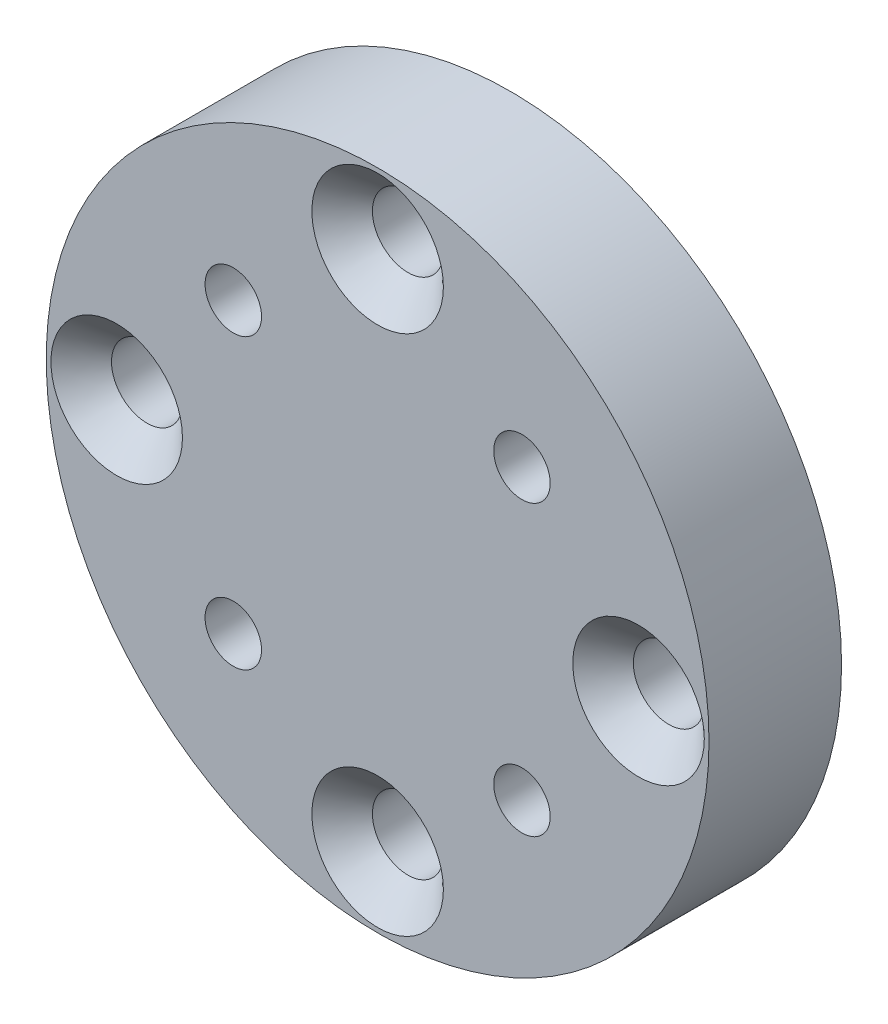
ISO-10303-21;
HEADER;
FILE_DESCRIPTION(('STEP AP214'),'2;1');
FILE_NAME('part.step','',(''),(''),'','','');
FILE_SCHEMA(('AUTOMOTIVE_DESIGN { 1 0 10303 214 1 1 1 1 }'));
ENDSEC;
DATA;
#1=APPLICATION_CONTEXT('core data for automotive mechanical design processes');
#2=APPLICATION_PROTOCOL_DEFINITION('international standard','automotive_design',2000,#1);
#3=PRODUCT_CONTEXT('',#1,'mechanical');
#4=PRODUCT('Part','Part','',(#3));
#5=PRODUCT_RELATED_PRODUCT_CATEGORY('part','',(#4));
#6=PRODUCT_DEFINITION_FORMATION('','',#4);
#7=PRODUCT_DEFINITION_CONTEXT('part definition',#1,'design');
#8=PRODUCT_DEFINITION('design','',#6,#7);
#9=PRODUCT_DEFINITION_SHAPE('','',#8);
#10=(LENGTH_UNIT() NAMED_UNIT(*) SI_UNIT(.MILLI.,.METRE.));
#11=(NAMED_UNIT(*) PLANE_ANGLE_UNIT() SI_UNIT($,.RADIAN.));
#12=(NAMED_UNIT(*) SI_UNIT($,.STERADIAN.) SOLID_ANGLE_UNIT());
#13=UNCERTAINTY_MEASURE_WITH_UNIT(LENGTH_MEASURE(1.E-05),#10,'distance_accuracy_value','');
#14=(GEOMETRIC_REPRESENTATION_CONTEXT(3) GLOBAL_UNCERTAINTY_ASSIGNED_CONTEXT((#13)) GLOBAL_UNIT_ASSIGNED_CONTEXT((#10,
#11,#12)) REPRESENTATION_CONTEXT('',''));
#15=CARTESIAN_POINT('',(0.,0.,0.));
#16=DIRECTION('',(0.,0.,1.));
#17=DIRECTION('',(1.,0.,0.));
#18=AXIS2_PLACEMENT_3D('',#15,#16,#17);
#19=CARTESIAN_POINT('',(0.,0.,6.35));
#20=DIRECTION('',(0.,0.,-1.));
#21=DIRECTION('',(-1.,0.,0.));
#22=AXIS2_PLACEMENT_3D('',#19,#20,#21);
#23=CYLINDRICAL_SURFACE('',#22,15.875);
#24=CARTESIAN_POINT('',(0.,0.,6.35));
#25=DIRECTION('',(0.,0.,1.));
#26=DIRECTION('',(1.,0.,0.));
#27=AXIS2_PLACEMENT_3D('',#24,#25,#26);
#28=CIRCLE('',#27,15.875);
#29=CARTESIAN_POINT('',(15.875,0.,6.35));
#30=VERTEX_POINT('',#29);
#31=EDGE_CURVE('E10',#30,#30,#28,.T.);
#32=ORIENTED_EDGE('',*,*,#31,.F.);
#33=EDGE_LOOP('',(#32));
#34=FACE_BOUND('',#33,.T.);
#35=CARTESIAN_POINT('',(0.,0.,0.));
#36=DIRECTION('',(0.,0.,1.));
#37=DIRECTION('',(1.,0.,0.));
#38=AXIS2_PLACEMENT_3D('',#35,#36,#37);
#39=CIRCLE('',#38,15.875);
#40=CARTESIAN_POINT('',(15.875,0.,0.));
#41=VERTEX_POINT('',#40);
#42=EDGE_CURVE('E35',#41,#41,#39,.T.);
#43=ORIENTED_EDGE('',*,*,#42,.T.);
#44=EDGE_LOOP('',(#43));
#45=FACE_BOUND('',#44,.T.);
#46=ADVANCED_FACE('F32',(#34,#45),#23,.T.);
#47=CARTESIAN_POINT('',(0.,0.,6.35));
#48=DIRECTION('',(0.,0.,1.));
#49=DIRECTION('',(1.,0.,0.));
#50=AXIS2_PLACEMENT_3D('',#47,#48,#49);
#51=PLANE('',#50);
#52=CARTESIAN_POINT('',(6.91479721322325,6.91479721322325,6.35));
#53=DIRECTION('',(0.,0.,1.));
#54=DIRECTION('',(1.,0.,0.));
#55=AXIS2_PLACEMENT_3D('',#52,#53,#54);
#56=CIRCLE('',#55,1.35254999999999);
#57=CARTESIAN_POINT('',(8.26734721322324,6.91479721322325,6.35));
#58=VERTEX_POINT('',#57);
#59=EDGE_CURVE('E100',#58,#58,#56,.T.);
#60=ORIENTED_EDGE('',*,*,#59,.F.);
#61=EDGE_LOOP('',(#60));
#62=FACE_BOUND('',#61,.T.);
#63=CARTESIAN_POINT('',(6.91479721322324,-6.91479721322324,6.35));
#64=DIRECTION('',(0.,0.,1.));
#65=DIRECTION('',(1.,0.,0.));
#66=AXIS2_PLACEMENT_3D('',#63,#64,#65);
#67=CIRCLE('',#66,1.35254999999999);
#68=CARTESIAN_POINT('',(8.26734721322323,-6.91479721322324,6.35));
#69=VERTEX_POINT('',#68);
#70=EDGE_CURVE('E94',#69,#69,#67,.T.);
#71=ORIENTED_EDGE('',*,*,#70,.F.);
#72=EDGE_LOOP('',(#71));
#73=FACE_BOUND('',#72,.T.);
#74=CARTESIAN_POINT('',(-6.91479721322325,-6.91479721322325,6.35));
#75=DIRECTION('',(0.,0.,1.));
#76=DIRECTION('',(1.,0.,0.));
#77=AXIS2_PLACEMENT_3D('',#74,#75,#76);
#78=CIRCLE('',#77,1.35254999999999);
#79=CARTESIAN_POINT('',(-5.56224721322326,-6.91479721322325,6.35));
#80=VERTEX_POINT('',#79);
#81=EDGE_CURVE('E88',#80,#80,#78,.T.);
#82=ORIENTED_EDGE('',*,*,#81,.F.);
#83=EDGE_LOOP('',(#82));
#84=FACE_BOUND('',#83,.T.);
#85=CARTESIAN_POINT('',(-6.91479721322325,6.91479721322325,6.35));
#86=DIRECTION('',(0.,0.,1.));
#87=DIRECTION('',(1.,0.,0.));
#88=AXIS2_PLACEMENT_3D('',#85,#86,#87);
#89=CIRCLE('',#88,1.35254999999999);
#90=CARTESIAN_POINT('',(-5.56224721322326,6.91479721322325,6.35));
#91=VERTEX_POINT('',#90);
#92=EDGE_CURVE('E82',#91,#91,#89,.T.);
#93=ORIENTED_EDGE('',*,*,#92,.F.);
#94=EDGE_LOOP('',(#93));
#95=FACE_BOUND('',#94,.T.);
#96=CARTESIAN_POINT('',(0.,12.5,6.35));
#97=DIRECTION('',(0.,0.,1.));
#98=DIRECTION('',(1.,0.,0.));
#99=AXIS2_PLACEMENT_3D('',#96,#97,#98);
#100=CIRCLE('',#99,3.15);
#101=CARTESIAN_POINT('',(3.15,12.5,6.35));
#102=VERTEX_POINT('',#101);
#103=EDGE_CURVE('E76',#102,#102,#100,.T.);
#104=ORIENTED_EDGE('',*,*,#103,.F.);
#105=EDGE_LOOP('',(#104));
#106=FACE_BOUND('',#105,.T.);
#107=CARTESIAN_POINT('',(0.,-12.5,6.35));
#108=DIRECTION('',(0.,0.,1.));
#109=DIRECTION('',(1.,0.,0.));
#110=AXIS2_PLACEMENT_3D('',#107,#108,#109);
#111=CIRCLE('',#110,3.15);
#112=CARTESIAN_POINT('',(3.15,-12.5,6.35));
#113=VERTEX_POINT('',#112);
#114=EDGE_CURVE('E67',#113,#113,#111,.T.);
#115=ORIENTED_EDGE('',*,*,#114,.F.);
#116=EDGE_LOOP('',(#115));
#117=FACE_BOUND('',#116,.T.);
#118=CARTESIAN_POINT('',(12.5,0.,6.35));
#119=DIRECTION('',(0.,0.,1.));
#120=DIRECTION('',(1.,0.,0.));
#121=AXIS2_PLACEMENT_3D('',#118,#119,#120);
#122=CIRCLE('',#121,3.15);
#123=CARTESIAN_POINT('',(15.65,0.,6.35));
#124=VERTEX_POINT('',#123);
#125=EDGE_CURVE('E58',#124,#124,#122,.T.);
#126=ORIENTED_EDGE('',*,*,#125,.F.);
#127=EDGE_LOOP('',(#126));
#128=FACE_BOUND('',#127,.T.);
#129=CARTESIAN_POINT('',(-12.5,0.,6.35));
#130=DIRECTION('',(0.,0.,1.));
#131=DIRECTION('',(1.,0.,0.));
#132=AXIS2_PLACEMENT_3D('',#129,#130,#131);
#133=CIRCLE('',#132,3.15);
#134=CARTESIAN_POINT('',(-9.35,0.,6.35));
#135=VERTEX_POINT('',#134);
#136=EDGE_CURVE('E49',#135,#135,#133,.T.);
#137=ORIENTED_EDGE('',*,*,#136,.F.);
#138=EDGE_LOOP('',(#137));
#139=FACE_BOUND('',#138,.T.);
#140=ORIENTED_EDGE('',*,*,#31,.T.);
#141=EDGE_LOOP('',(#140));
#142=FACE_BOUND('',#141,.T.);
#143=ADVANCED_FACE('F106',(#62,#73,#84,#95,#106,#117,#128,#139,#142),#51,.T.);
#144=CARTESIAN_POINT('',(0.,0.,0.));
#145=DIRECTION('',(0.,0.,1.));
#146=DIRECTION('',(1.,0.,0.));
#147=AXIS2_PLACEMENT_3D('',#144,#145,#146);
#148=PLANE('',#147);
#149=CARTESIAN_POINT('',(6.91479721322325,6.91479721322325,0.));
#150=DIRECTION('',(0.,0.,1.));
#151=DIRECTION('',(1.,0.,0.));
#152=AXIS2_PLACEMENT_3D('',#149,#150,#151);
#153=CIRCLE('',#152,1.35255);
#154=CARTESIAN_POINT('',(8.26734721322325,6.91479721322325,0.));
#155=VERTEX_POINT('',#154);
#156=EDGE_CURVE('E97',#155,#155,#153,.T.);
#157=ORIENTED_EDGE('',*,*,#156,.T.);
#158=EDGE_LOOP('',(#157));
#159=FACE_BOUND('',#158,.T.);
#160=CARTESIAN_POINT('',(6.91479721322324,-6.91479721322324,0.));
#161=DIRECTION('',(0.,0.,1.));
#162=DIRECTION('',(1.,0.,0.));
#163=AXIS2_PLACEMENT_3D('',#160,#161,#162);
#164=CIRCLE('',#163,1.35255);
#165=CARTESIAN_POINT('',(8.26734721322324,-6.91479721322324,0.));
#166=VERTEX_POINT('',#165);
#167=EDGE_CURVE('E91',#166,#166,#164,.T.);
#168=ORIENTED_EDGE('',*,*,#167,.T.);
#169=EDGE_LOOP('',(#168));
#170=FACE_BOUND('',#169,.T.);
#171=CARTESIAN_POINT('',(-6.91479721322325,-6.91479721322325,0.));
#172=DIRECTION('',(0.,0.,1.));
#173=DIRECTION('',(1.,0.,0.));
#174=AXIS2_PLACEMENT_3D('',#171,#172,#173);
#175=CIRCLE('',#174,1.35255);
#176=CARTESIAN_POINT('',(-5.56224721322325,-6.91479721322325,0.));
#177=VERTEX_POINT('',#176);
#178=EDGE_CURVE('E85',#177,#177,#175,.T.);
#179=ORIENTED_EDGE('',*,*,#178,.T.);
#180=EDGE_LOOP('',(#179));
#181=FACE_BOUND('',#180,.T.);
#182=CARTESIAN_POINT('',(-6.91479721322325,6.91479721322325,0.));
#183=DIRECTION('',(0.,0.,1.));
#184=DIRECTION('',(1.,0.,0.));
#185=AXIS2_PLACEMENT_3D('',#182,#183,#184);
#186=CIRCLE('',#185,1.35255);
#187=CARTESIAN_POINT('',(-5.56224721322325,6.91479721322325,0.));
#188=VERTEX_POINT('',#187);
#189=EDGE_CURVE('E79',#188,#188,#186,.T.);
#190=ORIENTED_EDGE('',*,*,#189,.T.);
#191=EDGE_LOOP('',(#190));
#192=FACE_BOUND('',#191,.T.);
#193=CARTESIAN_POINT('',(0.,12.5,0.));
#194=DIRECTION('',(0.,0.,1.));
#195=DIRECTION('',(1.,0.,0.));
#196=AXIS2_PLACEMENT_3D('',#193,#194,#195);
#197=CIRCLE('',#196,1.7);
#198=CARTESIAN_POINT('',(1.7,12.5,0.));
#199=VERTEX_POINT('',#198);
#200=EDGE_CURVE('E70',#199,#199,#197,.T.);
#201=ORIENTED_EDGE('',*,*,#200,.T.);
#202=EDGE_LOOP('',(#201));
#203=FACE_BOUND('',#202,.T.);
#204=CARTESIAN_POINT('',(0.,-12.5,0.));
#205=DIRECTION('',(0.,0.,1.));
#206=DIRECTION('',(1.,0.,0.));
#207=AXIS2_PLACEMENT_3D('',#204,#205,#206);
#208=CIRCLE('',#207,1.7);
#209=CARTESIAN_POINT('',(1.7,-12.5,0.));
#210=VERTEX_POINT('',#209);
#211=EDGE_CURVE('E61',#210,#210,#208,.T.);
#212=ORIENTED_EDGE('',*,*,#211,.T.);
#213=EDGE_LOOP('',(#212));
#214=FACE_BOUND('',#213,.T.);
#215=CARTESIAN_POINT('',(12.5,0.,0.));
#216=DIRECTION('',(0.,0.,1.));
#217=DIRECTION('',(1.,0.,0.));
#218=AXIS2_PLACEMENT_3D('',#215,#216,#217);
#219=CIRCLE('',#218,1.7);
#220=CARTESIAN_POINT('',(14.2,0.,0.));
#221=VERTEX_POINT('',#220);
#222=EDGE_CURVE('E52',#221,#221,#219,.T.);
#223=ORIENTED_EDGE('',*,*,#222,.T.);
#224=EDGE_LOOP('',(#223));
#225=FACE_BOUND('',#224,.T.);
#226=CARTESIAN_POINT('',(-12.5,0.,0.));
#227=DIRECTION('',(0.,0.,1.));
#228=DIRECTION('',(1.,0.,0.));
#229=AXIS2_PLACEMENT_3D('',#226,#227,#228);
#230=CIRCLE('',#229,1.7);
#231=CARTESIAN_POINT('',(-10.8,0.,0.));
#232=VERTEX_POINT('',#231);
#233=EDGE_CURVE('E42',#232,#232,#230,.T.);
#234=ORIENTED_EDGE('',*,*,#233,.T.);
#235=EDGE_LOOP('',(#234));
#236=FACE_BOUND('',#235,.T.);
#237=ORIENTED_EDGE('',*,*,#42,.F.);
#238=EDGE_LOOP('',(#237));
#239=FACE_BOUND('',#238,.T.);
#240=ADVANCED_FACE('F109',(#159,#170,#181,#192,#203,#214,#225,#236,#239),#148,.F.);
#241=CARTESIAN_POINT('',(-12.5,0.,6.35));
#242=DIRECTION('',(0.,0.,1.));
#243=DIRECTION('',(1.,0.,0.));
#244=AXIS2_PLACEMENT_3D('',#241,#242,#243);
#245=CYLINDRICAL_SURFACE('',#244,1.7);
#246=ORIENTED_EDGE('',*,*,#233,.F.);
#247=EDGE_LOOP('',(#246));
#248=FACE_BOUND('',#247,.T.);
#249=CARTESIAN_POINT('',(-12.5,0.,4.9));
#250=DIRECTION('',(0.,0.,1.));
#251=DIRECTION('',(1.,0.,0.));
#252=AXIS2_PLACEMENT_3D('',#249,#250,#251);
#253=CIRCLE('',#252,1.7);
#254=CARTESIAN_POINT('',(-10.8,0.,4.9));
#255=VERTEX_POINT('',#254);
#256=EDGE_CURVE('E46',#255,#255,#253,.T.);
#257=ORIENTED_EDGE('',*,*,#256,.T.);
#258=EDGE_LOOP('',(#257));
#259=FACE_BOUND('',#258,.T.);
#260=ADVANCED_FACE('F128',(#248,#259),#245,.F.);
#261=CARTESIAN_POINT('',(-12.5,0.,6.35));
#262=DIRECTION('',(0.,0.,1.));
#263=DIRECTION('',(1.,0.,0.));
#264=AXIS2_PLACEMENT_3D('',#261,#262,#263);
#265=CONICAL_SURFACE('',#264,3.15,0.785398163397449);
#266=ORIENTED_EDGE('',*,*,#256,.F.);
#267=EDGE_LOOP('',(#266));
#268=FACE_BOUND('',#267,.T.);
#269=ORIENTED_EDGE('',*,*,#136,.T.);
#270=EDGE_LOOP('',(#269));
#271=FACE_BOUND('',#270,.T.);
#272=ADVANCED_FACE('F125',(#268,#271),#265,.F.);
#273=CARTESIAN_POINT('',(12.5,0.,6.35));
#274=DIRECTION('',(0.,0.,1.));
#275=DIRECTION('',(1.,0.,0.));
#276=AXIS2_PLACEMENT_3D('',#273,#274,#275);
#277=CYLINDRICAL_SURFACE('',#276,1.7);
#278=ORIENTED_EDGE('',*,*,#222,.F.);
#279=EDGE_LOOP('',(#278));
#280=FACE_BOUND('',#279,.T.);
#281=CARTESIAN_POINT('',(12.5,0.,4.9));
#282=DIRECTION('',(0.,0.,1.));
#283=DIRECTION('',(1.,0.,0.));
#284=AXIS2_PLACEMENT_3D('',#281,#282,#283);
#285=CIRCLE('',#284,1.7);
#286=CARTESIAN_POINT('',(14.2,0.,4.9));
#287=VERTEX_POINT('',#286);
#288=EDGE_CURVE('E55',#287,#287,#285,.T.);
#289=ORIENTED_EDGE('',*,*,#288,.T.);
#290=EDGE_LOOP('',(#289));
#291=FACE_BOUND('',#290,.T.);
#292=ADVANCED_FACE('F127',(#280,#291),#277,.F.);
#293=CARTESIAN_POINT('',(12.5,0.,6.35));
#294=DIRECTION('',(0.,0.,1.));
#295=DIRECTION('',(1.,0.,0.));
#296=AXIS2_PLACEMENT_3D('',#293,#294,#295);
#297=CONICAL_SURFACE('',#296,3.15,0.785398163397449);
#298=ORIENTED_EDGE('',*,*,#288,.F.);
#299=EDGE_LOOP('',(#298));
#300=FACE_BOUND('',#299,.T.);
#301=ORIENTED_EDGE('',*,*,#125,.T.);
#302=EDGE_LOOP('',(#301));
#303=FACE_BOUND('',#302,.T.);
#304=ADVANCED_FACE('F135',(#300,#303),#297,.F.);
#305=CARTESIAN_POINT('',(0.,-12.5,6.35));
#306=DIRECTION('',(0.,0.,1.));
#307=DIRECTION('',(1.,0.,0.));
#308=AXIS2_PLACEMENT_3D('',#305,#306,#307);
#309=CYLINDRICAL_SURFACE('',#308,1.7);
#310=ORIENTED_EDGE('',*,*,#211,.F.);
#311=EDGE_LOOP('',(#310));
#312=FACE_BOUND('',#311,.T.);
#313=CARTESIAN_POINT('',(0.,-12.5,4.9));
#314=DIRECTION('',(0.,0.,1.));
#315=DIRECTION('',(1.,0.,0.));
#316=AXIS2_PLACEMENT_3D('',#313,#314,#315);
#317=CIRCLE('',#316,1.7);
#318=CARTESIAN_POINT('',(1.7,-12.5,4.9));
#319=VERTEX_POINT('',#318);
#320=EDGE_CURVE('E64',#319,#319,#317,.T.);
#321=ORIENTED_EDGE('',*,*,#320,.T.);
#322=EDGE_LOOP('',(#321));
#323=FACE_BOUND('',#322,.T.);
#324=ADVANCED_FACE('F173',(#312,#323),#309,.F.);
#325=CARTESIAN_POINT('',(0.,-12.5,6.35));
#326=DIRECTION('',(0.,0.,1.));
#327=DIRECTION('',(1.,0.,0.));
#328=AXIS2_PLACEMENT_3D('',#325,#326,#327);
#329=CONICAL_SURFACE('',#328,3.15,0.785398163397449);
#330=ORIENTED_EDGE('',*,*,#320,.F.);
#331=EDGE_LOOP('',(#330));
#332=FACE_BOUND('',#331,.T.);
#333=ORIENTED_EDGE('',*,*,#114,.T.);
#334=EDGE_LOOP('',(#333));
#335=FACE_BOUND('',#334,.T.);
#336=ADVANCED_FACE('F178',(#332,#335),#329,.F.);
#337=CARTESIAN_POINT('',(0.,12.5,6.35));
#338=DIRECTION('',(0.,0.,1.));
#339=DIRECTION('',(1.,0.,0.));
#340=AXIS2_PLACEMENT_3D('',#337,#338,#339);
#341=CYLINDRICAL_SURFACE('',#340,1.7);
#342=ORIENTED_EDGE('',*,*,#200,.F.);
#343=EDGE_LOOP('',(#342));
#344=FACE_BOUND('',#343,.T.);
#345=CARTESIAN_POINT('',(0.,12.5,4.9));
#346=DIRECTION('',(0.,0.,1.));
#347=DIRECTION('',(1.,0.,0.));
#348=AXIS2_PLACEMENT_3D('',#345,#346,#347);
#349=CIRCLE('',#348,1.7);
#350=CARTESIAN_POINT('',(1.7,12.5,4.9));
#351=VERTEX_POINT('',#350);
#352=EDGE_CURVE('E73',#351,#351,#349,.T.);
#353=ORIENTED_EDGE('',*,*,#352,.T.);
#354=EDGE_LOOP('',(#353));
#355=FACE_BOUND('',#354,.T.);
#356=ADVANCED_FACE('F184',(#344,#355),#341,.F.);
#357=CARTESIAN_POINT('',(0.,12.5,6.35));
#358=DIRECTION('',(0.,0.,1.));
#359=DIRECTION('',(1.,0.,0.));
#360=AXIS2_PLACEMENT_3D('',#357,#358,#359);
#361=CONICAL_SURFACE('',#360,3.15,0.785398163397449);
#362=ORIENTED_EDGE('',*,*,#352,.F.);
#363=EDGE_LOOP('',(#362));
#364=FACE_BOUND('',#363,.T.);
#365=ORIENTED_EDGE('',*,*,#103,.T.);
#366=EDGE_LOOP('',(#365));
#367=FACE_BOUND('',#366,.T.);
#368=ADVANCED_FACE('F188',(#364,#367),#361,.F.);
#369=CARTESIAN_POINT('',(-6.91479721322325,6.91479721322325,6.35));
#370=DIRECTION('',(0.,0.,1.));
#371=DIRECTION('',(1.,0.,0.));
#372=AXIS2_PLACEMENT_3D('',#369,#370,#371);
#373=CYLINDRICAL_SURFACE('',#372,1.35254999999999);
#374=ORIENTED_EDGE('',*,*,#189,.F.);
#375=EDGE_LOOP('',(#374));
#376=FACE_BOUND('',#375,.T.);
#377=ORIENTED_EDGE('',*,*,#92,.T.);
#378=EDGE_LOOP('',(#377));
#379=FACE_BOUND('',#378,.T.);
#380=ADVANCED_FACE('F192',(#376,#379),#373,.F.);
#381=CARTESIAN_POINT('',(-6.91479721322325,-6.91479721322325,6.35));
#382=DIRECTION('',(0.,0.,1.));
#383=DIRECTION('',(1.,0.,0.));
#384=AXIS2_PLACEMENT_3D('',#381,#382,#383);
#385=CYLINDRICAL_SURFACE('',#384,1.35254999999999);
#386=ORIENTED_EDGE('',*,*,#178,.F.);
#387=EDGE_LOOP('',(#386));
#388=FACE_BOUND('',#387,.T.);
#389=ORIENTED_EDGE('',*,*,#81,.T.);
#390=EDGE_LOOP('',(#389));
#391=FACE_BOUND('',#390,.T.);
#392=ADVANCED_FACE('F196',(#388,#391),#385,.F.);
#393=CARTESIAN_POINT('',(6.91479721322324,-6.91479721322324,6.35));
#394=DIRECTION('',(0.,0.,1.));
#395=DIRECTION('',(1.,0.,0.));
#396=AXIS2_PLACEMENT_3D('',#393,#394,#395);
#397=CYLINDRICAL_SURFACE('',#396,1.35254999999999);
#398=ORIENTED_EDGE('',*,*,#167,.F.);
#399=EDGE_LOOP('',(#398));
#400=FACE_BOUND('',#399,.T.);
#401=ORIENTED_EDGE('',*,*,#70,.T.);
#402=EDGE_LOOP('',(#401));
#403=FACE_BOUND('',#402,.T.);
#404=ADVANCED_FACE('F200',(#400,#403),#397,.F.);
#405=CARTESIAN_POINT('',(6.91479721322325,6.91479721322325,6.35));
#406=DIRECTION('',(0.,0.,1.));
#407=DIRECTION('',(1.,0.,0.));
#408=AXIS2_PLACEMENT_3D('',#405,#406,#407);
#409=CYLINDRICAL_SURFACE('',#408,1.35254999999999);
#410=ORIENTED_EDGE('',*,*,#156,.F.);
#411=EDGE_LOOP('',(#410));
#412=FACE_BOUND('',#411,.T.);
#413=ORIENTED_EDGE('',*,*,#59,.T.);
#414=EDGE_LOOP('',(#413));
#415=FACE_BOUND('',#414,.T.);
#416=ADVANCED_FACE('F104',(#412,#415),#409,.F.);
#417=CLOSED_SHELL('',(#46,#143,#240,#260,#272,#292,#304,#324,#336,#356,#368,#380,#392,#404,#416));
#418=MANIFOLD_SOLID_BREP('B2',#417);
#419=ADVANCED_BREP_SHAPE_REPRESENTATION('',(#18,#418),#14);
#420=SHAPE_DEFINITION_REPRESENTATION(#9,#419);
ENDSEC;
END-ISO-10303-21;
